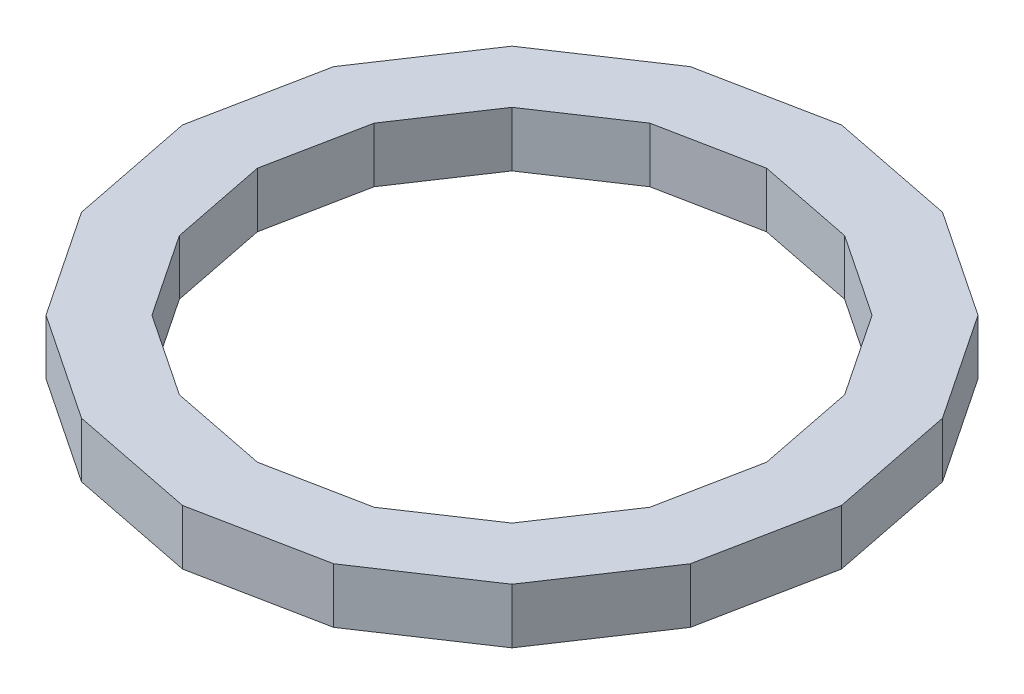
ISO-10303-21;
HEADER;
FILE_DESCRIPTION(('STEP AP214'),'2;1');
FILE_NAME('part.step','',(''),(''),'','','');
FILE_SCHEMA(('AUTOMOTIVE_DESIGN { 1 0 10303 214 1 1 1 1 }'));
ENDSEC;
DATA;
#1=APPLICATION_CONTEXT('core data for automotive mechanical design processes');
#2=APPLICATION_PROTOCOL_DEFINITION('international standard','automotive_design',2000,#1);
#3=PRODUCT_CONTEXT('',#1,'mechanical');
#4=PRODUCT('Part','Part','',(#3));
#5=PRODUCT_RELATED_PRODUCT_CATEGORY('part','',(#4));
#6=PRODUCT_DEFINITION_FORMATION('','',#4);
#7=PRODUCT_DEFINITION_CONTEXT('part definition',#1,'design');
#8=PRODUCT_DEFINITION('design','',#6,#7);
#9=PRODUCT_DEFINITION_SHAPE('','',#8);
#10=(LENGTH_UNIT() NAMED_UNIT(*) SI_UNIT(.MILLI.,.METRE.));
#11=(NAMED_UNIT(*) PLANE_ANGLE_UNIT() SI_UNIT($,.RADIAN.));
#12=(NAMED_UNIT(*) SI_UNIT($,.STERADIAN.) SOLID_ANGLE_UNIT());
#13=UNCERTAINTY_MEASURE_WITH_UNIT(LENGTH_MEASURE(1.E-05),#10,'distance_accuracy_value','');
#14=(GEOMETRIC_REPRESENTATION_CONTEXT(3) GLOBAL_UNCERTAINTY_ASSIGNED_CONTEXT((#13)) GLOBAL_UNIT_ASSIGNED_CONTEXT((#10,
#11,#12)) REPRESENTATION_CONTEXT('',''));
#15=CARTESIAN_POINT('',(0.,0.,0.));
#16=DIRECTION('',(0.,0.,1.));
#17=DIRECTION('',(1.,0.,0.));
#18=AXIS2_PLACEMENT_3D('',#15,#16,#17);
#19=CARTESIAN_POINT('',(0.,19.05,0.));
#20=DIRECTION('',(0.,1.,0.));
#21=DIRECTION('',(0.,0.,1.));
#22=AXIS2_PLACEMENT_3D('',#19,#20,#21);
#23=PLANE('',#22);
#24=DIRECTION('',(0.195090322016117,0.,-0.980785280403233));
#25=VECTOR('',#24,1.);
#26=CARTESIAN_POINT('',(105.249826838494,19.05,43.5959057139224));
#27=LINE('',#26,#25);
#28=CARTESIAN_POINT('',(105.249826838494,19.05,43.5959057139224));
#29=VERTEX_POINT('',#28);
#30=CARTESIAN_POINT('',(113.92159165211,19.05,-1.30104753782133E-12));
#31=VERTEX_POINT('',#30);
#32=EDGE_CURVE('E380',#29,#31,#27,.T.);
#33=ORIENTED_EDGE('',*,*,#32,.T.);
#34=DIRECTION('',(-0.195090322016139,0.,-0.980785280403228));
#35=VECTOR('',#34,1.);
#36=CARTESIAN_POINT('',(113.92159165211,19.05,-1.30104753782133E-12));
#37=LINE('',#36,#35);
#38=CARTESIAN_POINT('',(105.249826838493,19.05,-43.5959057139248));
#39=VERTEX_POINT('',#38);
#40=EDGE_CURVE('E384',#31,#39,#37,.T.);
#41=ORIENTED_EDGE('',*,*,#40,.T.);
#42=DIRECTION('',(-0.555570233019612,0.,-0.831469612302538));
#43=VECTOR('',#42,1.);
#44=CARTESIAN_POINT('',(105.249826838493,19.05,-43.5959057139248));
#45=LINE('',#44,#43);
#46=CARTESIAN_POINT('',(80.5547299807708,19.05,-80.5547299807726));
#47=VERTEX_POINT('',#46);
#48=EDGE_CURVE('E388',#39,#47,#45,.T.);
#49=ORIENTED_EDGE('',*,*,#48,.T.);
#50=DIRECTION('',(-0.831469612302551,0.,-0.555570233019593));
#51=VECTOR('',#50,1.);
#52=CARTESIAN_POINT('',(80.5547299807708,19.05,-80.5547299807726));
#53=LINE('',#52,#51);
#54=CARTESIAN_POINT('',(43.5959057139224,19.05,-105.249826838494));
#55=VERTEX_POINT('',#54);
#56=EDGE_CURVE('E391',#47,#55,#53,.T.);
#57=ORIENTED_EDGE('',*,*,#56,.T.);
#58=DIRECTION('',(-0.980785280403233,0.,-0.195090322016117));
#59=VECTOR('',#58,1.);
#60=CARTESIAN_POINT('',(43.5959057139224,19.05,-105.249826838494));
#61=LINE('',#60,#59);
#62=CARTESIAN_POINT('',(-1.30282443333279E-12,19.05,-113.92159165211));
#63=VERTEX_POINT('',#62);
#64=EDGE_CURVE('E393',#55,#63,#61,.T.);
#65=ORIENTED_EDGE('',*,*,#64,.T.);
#66=DIRECTION('',(-0.980785280403228,0.,0.195090322016139));
#67=VECTOR('',#66,1.);
#68=CARTESIAN_POINT('',(-1.30282443333279E-12,19.05,-113.92159165211));
#69=LINE('',#68,#67);
#70=CARTESIAN_POINT('',(-43.5959057139248,19.05,-105.249826838493));
#71=VERTEX_POINT('',#70);
#72=EDGE_CURVE('E395',#63,#71,#69,.T.);
#73=ORIENTED_EDGE('',*,*,#72,.T.);
#74=DIRECTION('',(-0.831469612302539,0.,0.555570233019612));
#75=VECTOR('',#74,1.);
#76=CARTESIAN_POINT('',(-43.5959057139248,19.05,-105.249826838493));
#77=LINE('',#76,#75);
#78=CARTESIAN_POINT('',(-80.5547299807726,19.05,-80.5547299807708));
#79=VERTEX_POINT('',#78);
#80=EDGE_CURVE('E397',#71,#79,#77,.T.);
#81=ORIENTED_EDGE('',*,*,#80,.T.);
#82=DIRECTION('',(-0.555570233019592,0.,0.831469612302552));
#83=VECTOR('',#82,1.);
#84=CARTESIAN_POINT('',(-80.5547299807726,19.05,-80.5547299807708));
#85=LINE('',#84,#83);
#86=CARTESIAN_POINT('',(-105.249826838494,19.05,-43.5959057139223));
#87=VERTEX_POINT('',#86);
#88=EDGE_CURVE('E399',#79,#87,#85,.T.);
#89=ORIENTED_EDGE('',*,*,#88,.T.);
#90=DIRECTION('',(-0.195090322016117,0.,0.980785280403233));
#91=VECTOR('',#90,1.);
#92=CARTESIAN_POINT('',(-105.249826838494,19.05,-43.5959057139223));
#93=LINE('',#92,#91);
#94=CARTESIAN_POINT('',(-113.92159165211,19.05,1.29133654033675E-12));
#95=VERTEX_POINT('',#94);
#96=EDGE_CURVE('E401',#87,#95,#93,.T.);
#97=ORIENTED_EDGE('',*,*,#96,.T.);
#98=DIRECTION('',(0.195090322016139,0.,0.980785280403228));
#99=VECTOR('',#98,1.);
#100=CARTESIAN_POINT('',(-113.92159165211,19.05,1.29133654033675E-12));
#101=LINE('',#100,#99);
#102=CARTESIAN_POINT('',(-105.249826838493,19.05,43.5959057139248));
#103=VERTEX_POINT('',#102);
#104=EDGE_CURVE('E403',#95,#103,#101,.T.);
#105=ORIENTED_EDGE('',*,*,#104,.T.);
#106=DIRECTION('',(0.555570233019612,0.,0.831469612302539));
#107=VECTOR('',#106,1.);
#108=CARTESIAN_POINT('',(-105.249826838493,19.05,43.5959057139248));
#109=LINE('',#108,#107);
#110=CARTESIAN_POINT('',(-80.5547299807708,19.05,80.5547299807726));
#111=VERTEX_POINT('',#110);
#112=EDGE_CURVE('E405',#103,#111,#109,.T.);
#113=ORIENTED_EDGE('',*,*,#112,.T.);
#114=DIRECTION('',(0.831469612302552,0.,0.555570233019593));
#115=VECTOR('',#114,1.);
#116=CARTESIAN_POINT('',(-80.5547299807708,19.05,80.5547299807726));
#117=LINE('',#116,#115);
#118=CARTESIAN_POINT('',(-43.5959057139224,19.05,105.249826838494));
#119=VERTEX_POINT('',#118);
#120=EDGE_CURVE('E407',#111,#119,#117,.T.);
#121=ORIENTED_EDGE('',*,*,#120,.T.);
#122=DIRECTION('',(0.980785280403233,0.,0.195090322016117));
#123=VECTOR('',#122,1.);
#124=CARTESIAN_POINT('',(-43.5959057139224,19.05,105.249826838494));
#125=LINE('',#124,#123);
#126=CARTESIAN_POINT('',(1.2751882066272E-12,19.05,113.92159165211));
#127=VERTEX_POINT('',#126);
#128=EDGE_CURVE('E409',#119,#127,#125,.T.);
#129=ORIENTED_EDGE('',*,*,#128,.T.);
#130=DIRECTION('',(0.980785280403228,0.,-0.195090322016139));
#131=VECTOR('',#130,1.);
#132=CARTESIAN_POINT('',(1.2751882066272E-12,19.05,113.92159165211));
#133=LINE('',#132,#131);
#134=CARTESIAN_POINT('',(43.5959057139248,19.05,105.249826838493));
#135=VERTEX_POINT('',#134);
#136=EDGE_CURVE('E411',#127,#135,#133,.T.);
#137=ORIENTED_EDGE('',*,*,#136,.T.);
#138=DIRECTION('',(0.831469612302539,0.,-0.555570233019612));
#139=VECTOR('',#138,1.);
#140=CARTESIAN_POINT('',(43.5959057139248,19.05,105.249826838493));
#141=LINE('',#140,#139);
#142=CARTESIAN_POINT('',(80.5547299807726,19.05,80.5547299807708));
#143=VERTEX_POINT('',#142);
#144=EDGE_CURVE('E413',#135,#143,#141,.T.);
#145=ORIENTED_EDGE('',*,*,#144,.T.);
#146=DIRECTION('',(0.555570233019593,0.,-0.831469612302552));
#147=VECTOR('',#146,1.);
#148=CARTESIAN_POINT('',(80.5547299807726,19.05,80.5547299807708));
#149=LINE('',#148,#147);
#150=EDGE_CURVE('E415',#143,#29,#149,.T.);
#151=ORIENTED_EDGE('',*,*,#150,.T.);
#152=EDGE_LOOP('',(#33,#41,#49,#57,#65,#73,#81,#89,#97,#105,#113,#121,#129,#137,#145,#151));
#153=FACE_BOUND('',#152,.T.);
#154=DIRECTION('',(-0.19509032201614,0.,-0.980785280403228));
#155=VECTOR('',#154,1.);
#156=CARTESIAN_POINT('',(88.0239762336186,19.05,-1.0275439763759E-12));
#157=LINE('',#156,#155);
#158=CARTESIAN_POINT('',(88.0239762336186,19.05,-1.0275439763759E-12));
#159=VERTEX_POINT('',#158);
#160=CARTESIAN_POINT('',(81.3235500124998,19.05,-33.6853173555052));
#161=VERTEX_POINT('',#160);
#162=EDGE_CURVE('E253',#159,#161,#157,.T.);
#163=ORIENTED_EDGE('',*,*,#162,.F.);
#164=DIRECTION('',(0.195090322016117,0.,-0.980785280403233));
#165=VECTOR('',#164,1.);
#166=CARTESIAN_POINT('',(81.3235500125006,19.05,33.6853173555033));
#167=LINE('',#166,#165);
#168=CARTESIAN_POINT('',(81.3235500125006,19.05,33.6853173555033));
#169=VERTEX_POINT('',#168);
#170=EDGE_CURVE('E244',#169,#159,#167,.T.);
#171=ORIENTED_EDGE('',*,*,#170,.F.);
#172=DIRECTION('',(0.555570233019593,0.,-0.831469612302552));
#173=VECTOR('',#172,1.);
#174=CARTESIAN_POINT('',(62.2423505017959,19.05,62.2423505017945));
#175=LINE('',#174,#173);
#176=CARTESIAN_POINT('',(62.2423505017959,19.05,62.2423505017945));
#177=VERTEX_POINT('',#176);
#178=EDGE_CURVE('E303',#177,#169,#175,.T.);
#179=ORIENTED_EDGE('',*,*,#178,.F.);
#180=DIRECTION('',(0.831469612302539,0.,-0.555570233019612));
#181=VECTOR('',#180,1.);
#182=CARTESIAN_POINT('',(33.6853173555052,19.05,81.3235500124998));
#183=LINE('',#182,#181);
#184=CARTESIAN_POINT('',(33.6853173555052,19.05,81.3235500124998));
#185=VERTEX_POINT('',#184);
#186=EDGE_CURVE('E301',#185,#177,#183,.T.);
#187=ORIENTED_EDGE('',*,*,#186,.F.);
#188=DIRECTION('',(0.980785280403228,0.,-0.19509032201614));
#189=VECTOR('',#188,1.);
#190=CARTESIAN_POINT('',(9.863004184879E-13,19.05,88.0239762336186));
#191=LINE('',#190,#189);
#192=CARTESIAN_POINT('',(9.863004184879E-13,19.05,88.0239762336186));
#193=VERTEX_POINT('',#192);
#194=EDGE_CURVE('E299',#193,#185,#191,.T.);
#195=ORIENTED_EDGE('',*,*,#194,.F.);
#196=DIRECTION('',(0.980785280403233,0.,0.195090322016117));
#197=VECTOR('',#196,1.);
#198=CARTESIAN_POINT('',(-33.6853173555033,19.05,81.3235500125006));
#199=LINE('',#198,#197);
#200=CARTESIAN_POINT('',(-33.6853173555033,19.05,81.3235500125006));
#201=VERTEX_POINT('',#200);
#202=EDGE_CURVE('E297',#201,#193,#199,.T.);
#203=ORIENTED_EDGE('',*,*,#202,.F.);
#204=DIRECTION('',(0.831469612302552,0.,0.555570233019593));
#205=VECTOR('',#204,1.);
#206=CARTESIAN_POINT('',(-62.2423505017944,19.05,62.2423505017959));
#207=LINE('',#206,#205);
#208=CARTESIAN_POINT('',(-62.2423505017944,19.05,62.2423505017959));
#209=VERTEX_POINT('',#208);
#210=EDGE_CURVE('E295',#209,#201,#207,.T.);
#211=ORIENTED_EDGE('',*,*,#210,.F.);
#212=DIRECTION('',(0.555570233019612,0.,0.831469612302539));
#213=VECTOR('',#212,1.);
#214=CARTESIAN_POINT('',(-81.3235500124998,19.05,33.6853173555052));
#215=LINE('',#214,#213);
#216=CARTESIAN_POINT('',(-81.3235500124998,19.05,33.6853173555052));
#217=VERTEX_POINT('',#216);
#218=EDGE_CURVE('E292',#217,#209,#215,.T.);
#219=ORIENTED_EDGE('',*,*,#218,.F.);
#220=DIRECTION('',(0.19509032201614,0.,0.980785280403228));
#221=VECTOR('',#220,1.);
#222=CARTESIAN_POINT('',(-88.0239762336186,19.05,1.05508386293723E-12));
#223=LINE('',#222,#221);
#224=CARTESIAN_POINT('',(-88.0239762336186,19.05,1.05508386293723E-12));
#225=VERTEX_POINT('',#224);
#226=EDGE_CURVE('E290',#225,#217,#223,.T.);
#227=ORIENTED_EDGE('',*,*,#226,.F.);
#228=DIRECTION('',(-0.195090322016117,0.,0.980785280403233));
#229=VECTOR('',#228,1.);
#230=CARTESIAN_POINT('',(-81.3235500125005,19.05,-33.6853173555033));
#231=LINE('',#230,#229);
#232=CARTESIAN_POINT('',(-81.3235500125005,19.05,-33.6853173555033));
#233=VERTEX_POINT('',#232);
#234=EDGE_CURVE('E287',#233,#225,#231,.T.);
#235=ORIENTED_EDGE('',*,*,#234,.F.);
#236=DIRECTION('',(-0.555570233019592,0.,0.831469612302552));
#237=VECTOR('',#236,1.);
#238=CARTESIAN_POINT('',(-62.2423505017959,19.05,-62.2423505017945));
#239=LINE('',#238,#237);
#240=CARTESIAN_POINT('',(-62.2423505017959,19.05,-62.2423505017945));
#241=VERTEX_POINT('',#240);
#242=EDGE_CURVE('E285',#241,#233,#239,.T.);
#243=ORIENTED_EDGE('',*,*,#242,.F.);
#244=DIRECTION('',(-0.831469612302539,0.,0.555570233019612));
#245=VECTOR('',#244,1.);
#246=CARTESIAN_POINT('',(-33.6853173555052,19.05,-81.3235500124998));
#247=LINE('',#246,#245);
#248=CARTESIAN_POINT('',(-33.6853173555052,19.05,-81.3235500124998));
#249=VERTEX_POINT('',#248);
#250=EDGE_CURVE('E282',#249,#241,#247,.T.);
#251=ORIENTED_EDGE('',*,*,#250,.F.);
#252=DIRECTION('',(-0.980785280403228,0.,0.19509032201614));
#253=VECTOR('',#252,1.);
#254=CARTESIAN_POINT('',(-1.03390459015156E-12,19.05,-88.0239762336186));
#255=LINE('',#254,#253);
#256=CARTESIAN_POINT('',(-1.03390459015156E-12,19.05,-88.0239762336186));
#257=VERTEX_POINT('',#256);
#258=EDGE_CURVE('E280',#257,#249,#255,.T.);
#259=ORIENTED_EDGE('',*,*,#258,.F.);
#260=DIRECTION('',(-0.980785280403233,0.,-0.195090322016117));
#261=VECTOR('',#260,1.);
#262=CARTESIAN_POINT('',(33.6853173555034,19.05,-81.3235500125005));
#263=LINE('',#262,#261);
#264=CARTESIAN_POINT('',(33.6853173555034,19.05,-81.3235500125005));
#265=VERTEX_POINT('',#264);
#266=EDGE_CURVE('E278',#265,#257,#263,.T.);
#267=ORIENTED_EDGE('',*,*,#266,.F.);
#268=DIRECTION('',(-0.831469612302552,0.,-0.555570233019592));
#269=VECTOR('',#268,1.);
#270=CARTESIAN_POINT('',(62.2423505017945,19.05,-62.242350501796));
#271=LINE('',#270,#269);
#272=CARTESIAN_POINT('',(62.2423505017945,19.05,-62.242350501796));
#273=VERTEX_POINT('',#272);
#274=EDGE_CURVE('E273',#273,#265,#271,.T.);
#275=ORIENTED_EDGE('',*,*,#274,.F.);
#276=DIRECTION('',(-0.555570233019612,0.,-0.831469612302539));
#277=VECTOR('',#276,1.);
#278=CARTESIAN_POINT('',(81.3235500124998,19.05,-33.6853173555052));
#279=LINE('',#278,#277);
#280=EDGE_CURVE('E266',#161,#273,#279,.T.);
#281=ORIENTED_EDGE('',*,*,#280,.F.);
#282=EDGE_LOOP('',(#163,#171,#179,#187,#195,#203,#211,#219,#227,#235,#243,#251,#259,#267,#275,#281));
#283=FACE_BOUND('',#282,.T.);
#284=ADVANCED_FACE('F35',(#153,#283),#23,.T.);
#285=CARTESIAN_POINT('',(0.,0.,0.));
#286=DIRECTION('',(0.,1.,0.));
#287=DIRECTION('',(0.,0.,1.));
#288=AXIS2_PLACEMENT_3D('',#285,#286,#287);
#289=PLANE('',#288);
#290=DIRECTION('',(0.195090322016117,0.,-0.980785280403233));
#291=VECTOR('',#290,1.);
#292=CARTESIAN_POINT('',(105.249826838494,0.,43.5959057139224));
#293=LINE('',#292,#291);
#294=CARTESIAN_POINT('',(105.249826838494,0.,43.5959057139224));
#295=VERTEX_POINT('',#294);
#296=CARTESIAN_POINT('',(113.92159165211,0.,-1.30104753782133E-12));
#297=VERTEX_POINT('',#296);
#298=EDGE_CURVE('E261',#295,#297,#293,.T.);
#299=ORIENTED_EDGE('',*,*,#298,.F.);
#300=DIRECTION('',(0.555570233019593,0.,-0.831469612302552));
#301=VECTOR('',#300,1.);
#302=CARTESIAN_POINT('',(80.5547299807726,0.,80.5547299807708));
#303=LINE('',#302,#301);
#304=CARTESIAN_POINT('',(80.5547299807726,0.,80.5547299807708));
#305=VERTEX_POINT('',#304);
#306=EDGE_CURVE('E385',#305,#295,#303,.T.);
#307=ORIENTED_EDGE('',*,*,#306,.F.);
#308=DIRECTION('',(0.831469612302539,0.,-0.555570233019612));
#309=VECTOR('',#308,1.);
#310=CARTESIAN_POINT('',(43.5959057139248,0.,105.249826838493));
#311=LINE('',#310,#309);
#312=CARTESIAN_POINT('',(43.5959057139248,0.,105.249826838493));
#313=VERTEX_POINT('',#312);
#314=EDGE_CURVE('E449',#313,#305,#311,.T.);
#315=ORIENTED_EDGE('',*,*,#314,.F.);
#316=DIRECTION('',(0.980785280403228,0.,-0.195090322016139));
#317=VECTOR('',#316,1.);
#318=CARTESIAN_POINT('',(1.2751882066272E-12,0.,113.92159165211));
#319=LINE('',#318,#317);
#320=CARTESIAN_POINT('',(1.2751882066272E-12,0.,113.92159165211));
#321=VERTEX_POINT('',#320);
#322=EDGE_CURVE('E447',#321,#313,#319,.T.);
#323=ORIENTED_EDGE('',*,*,#322,.F.);
#324=DIRECTION('',(0.980785280403233,0.,0.195090322016117));
#325=VECTOR('',#324,1.);
#326=CARTESIAN_POINT('',(-43.5959057139224,0.,105.249826838494));
#327=LINE('',#326,#325);
#328=CARTESIAN_POINT('',(-43.5959057139224,0.,105.249826838494));
#329=VERTEX_POINT('',#328);
#330=EDGE_CURVE('E444',#329,#321,#327,.T.);
#331=ORIENTED_EDGE('',*,*,#330,.F.);
#332=DIRECTION('',(0.831469612302552,0.,0.555570233019593));
#333=VECTOR('',#332,1.);
#334=CARTESIAN_POINT('',(-80.5547299807708,0.,80.5547299807726));
#335=LINE('',#334,#333);
#336=CARTESIAN_POINT('',(-80.5547299807708,0.,80.5547299807726));
#337=VERTEX_POINT('',#336);
#338=EDGE_CURVE('E442',#337,#329,#335,.T.);
#339=ORIENTED_EDGE('',*,*,#338,.F.);
#340=DIRECTION('',(0.555570233019612,0.,0.831469612302539));
#341=VECTOR('',#340,1.);
#342=CARTESIAN_POINT('',(-105.249826838493,0.,43.5959057139248));
#343=LINE('',#342,#341);
#344=CARTESIAN_POINT('',(-105.249826838493,0.,43.5959057139248));
#345=VERTEX_POINT('',#344);
#346=EDGE_CURVE('E440',#345,#337,#343,.T.);
#347=ORIENTED_EDGE('',*,*,#346,.F.);
#348=DIRECTION('',(0.195090322016139,0.,0.980785280403228));
#349=VECTOR('',#348,1.);
#350=CARTESIAN_POINT('',(-113.92159165211,0.,1.29133654033675E-12));
#351=LINE('',#350,#349);
#352=CARTESIAN_POINT('',(-113.92159165211,0.,1.29133654033675E-12));
#353=VERTEX_POINT('',#352);
#354=EDGE_CURVE('E438',#353,#345,#351,.T.);
#355=ORIENTED_EDGE('',*,*,#354,.F.);
#356=DIRECTION('',(-0.195090322016117,0.,0.980785280403233));
#357=VECTOR('',#356,1.);
#358=CARTESIAN_POINT('',(-105.249826838494,0.,-43.5959057139223));
#359=LINE('',#358,#357);
#360=CARTESIAN_POINT('',(-105.249826838494,0.,-43.5959057139223));
#361=VERTEX_POINT('',#360);
#362=EDGE_CURVE('E436',#361,#353,#359,.T.);
#363=ORIENTED_EDGE('',*,*,#362,.F.);
#364=DIRECTION('',(-0.555570233019592,0.,0.831469612302552));
#365=VECTOR('',#364,1.);
#366=CARTESIAN_POINT('',(-80.5547299807726,0.,-80.5547299807708));
#367=LINE('',#366,#365);
#368=CARTESIAN_POINT('',(-80.5547299807726,0.,-80.5547299807708));
#369=VERTEX_POINT('',#368);
#370=EDGE_CURVE('E434',#369,#361,#367,.T.);
#371=ORIENTED_EDGE('',*,*,#370,.F.);
#372=DIRECTION('',(-0.831469612302539,0.,0.555570233019612));
#373=VECTOR('',#372,1.);
#374=CARTESIAN_POINT('',(-43.5959057139248,0.,-105.249826838493));
#375=LINE('',#374,#373);
#376=CARTESIAN_POINT('',(-43.5959057139248,0.,-105.249826838493));
#377=VERTEX_POINT('',#376);
#378=EDGE_CURVE('E432',#377,#369,#375,.T.);
#379=ORIENTED_EDGE('',*,*,#378,.F.);
#380=DIRECTION('',(-0.980785280403228,0.,0.195090322016139));
#381=VECTOR('',#380,1.);
#382=CARTESIAN_POINT('',(-1.30282443333279E-12,0.,-113.92159165211));
#383=LINE('',#382,#381);
#384=CARTESIAN_POINT('',(-1.30282443333279E-12,0.,-113.92159165211));
#385=VERTEX_POINT('',#384);
#386=EDGE_CURVE('E430',#385,#377,#383,.T.);
#387=ORIENTED_EDGE('',*,*,#386,.F.);
#388=DIRECTION('',(-0.980785280403233,0.,-0.195090322016117));
#389=VECTOR('',#388,1.);
#390=CARTESIAN_POINT('',(43.5959057139224,0.,-105.249826838494));
#391=LINE('',#390,#389);
#392=CARTESIAN_POINT('',(43.5959057139224,0.,-105.249826838494));
#393=VERTEX_POINT('',#392);
#394=EDGE_CURVE('E428',#393,#385,#391,.T.);
#395=ORIENTED_EDGE('',*,*,#394,.F.);
#396=DIRECTION('',(-0.831469612302551,0.,-0.555570233019593));
#397=VECTOR('',#396,1.);
#398=CARTESIAN_POINT('',(80.5547299807708,0.,-80.5547299807726));
#399=LINE('',#398,#397);
#400=CARTESIAN_POINT('',(80.5547299807708,0.,-80.5547299807726));
#401=VERTEX_POINT('',#400);
#402=EDGE_CURVE('E426',#401,#393,#399,.T.);
#403=ORIENTED_EDGE('',*,*,#402,.F.);
#404=DIRECTION('',(-0.555570233019612,0.,-0.831469612302538));
#405=VECTOR('',#404,1.);
#406=CARTESIAN_POINT('',(105.249826838493,0.,-43.5959057139248));
#407=LINE('',#406,#405);
#408=CARTESIAN_POINT('',(105.249826838493,0.,-43.5959057139248));
#409=VERTEX_POINT('',#408);
#410=EDGE_CURVE('E423',#409,#401,#407,.T.);
#411=ORIENTED_EDGE('',*,*,#410,.F.);
#412=DIRECTION('',(-0.195090322016139,0.,-0.980785280403228));
#413=VECTOR('',#412,1.);
#414=CARTESIAN_POINT('',(113.92159165211,0.,-1.30104753782133E-12));
#415=LINE('',#414,#413);
#416=EDGE_CURVE('E420',#297,#409,#415,.T.);
#417=ORIENTED_EDGE('',*,*,#416,.F.);
#418=EDGE_LOOP('',(#299,#307,#315,#323,#331,#339,#347,#355,#363,#371,#379,#387,#395,#403,#411,#417));
#419=FACE_BOUND('',#418,.T.);
#420=DIRECTION('',(0.195090322016117,0.,-0.980785280403233));
#421=VECTOR('',#420,1.);
#422=CARTESIAN_POINT('',(81.3235500125006,0.,33.6853173555033));
#423=LINE('',#422,#421);
#424=CARTESIAN_POINT('',(81.3235500125006,0.,33.6853173555033));
#425=VERTEX_POINT('',#424);
#426=CARTESIAN_POINT('',(88.0239762336186,0.,-1.0275439763759E-12));
#427=VERTEX_POINT('',#426);
#428=EDGE_CURVE('E58',#425,#427,#423,.T.);
#429=ORIENTED_EDGE('',*,*,#428,.T.);
#430=DIRECTION('',(-0.19509032201614,0.,-0.980785280403228));
#431=VECTOR('',#430,1.);
#432=CARTESIAN_POINT('',(88.0239762336186,0.,-1.0275439763759E-12));
#433=LINE('',#432,#431);
#434=CARTESIAN_POINT('',(81.3235500124998,0.,-33.6853173555052));
#435=VERTEX_POINT('',#434);
#436=EDGE_CURVE('E260',#427,#435,#433,.T.);
#437=ORIENTED_EDGE('',*,*,#436,.T.);
#438=DIRECTION('',(-0.555570233019612,0.,-0.831469612302539));
#439=VECTOR('',#438,1.);
#440=CARTESIAN_POINT('',(81.3235500124998,0.,-33.6853173555052));
#441=LINE('',#440,#439);
#442=CARTESIAN_POINT('',(62.2423505017945,0.,-62.242350501796));
#443=VERTEX_POINT('',#442);
#444=EDGE_CURVE('E309',#435,#443,#441,.T.);
#445=ORIENTED_EDGE('',*,*,#444,.T.);
#446=DIRECTION('',(-0.831469612302552,0.,-0.555570233019592));
#447=VECTOR('',#446,1.);
#448=CARTESIAN_POINT('',(62.2423505017945,0.,-62.242350501796));
#449=LINE('',#448,#447);
#450=CARTESIAN_POINT('',(33.6853173555034,0.,-81.3235500125005));
#451=VERTEX_POINT('',#450);
#452=EDGE_CURVE('E312',#443,#451,#449,.T.);
#453=ORIENTED_EDGE('',*,*,#452,.T.);
#454=DIRECTION('',(-0.980785280403233,0.,-0.195090322016117));
#455=VECTOR('',#454,1.);
#456=CARTESIAN_POINT('',(33.6853173555034,0.,-81.3235500125005));
#457=LINE('',#456,#455);
#458=CARTESIAN_POINT('',(-1.03390459015156E-12,0.,-88.0239762336186));
#459=VERTEX_POINT('',#458);
#460=EDGE_CURVE('E315',#451,#459,#457,.T.);
#461=ORIENTED_EDGE('',*,*,#460,.T.);
#462=DIRECTION('',(-0.980785280403228,0.,0.19509032201614));
#463=VECTOR('',#462,1.);
#464=CARTESIAN_POINT('',(-1.03390459015156E-12,0.,-88.0239762336186));
#465=LINE('',#464,#463);
#466=CARTESIAN_POINT('',(-33.6853173555052,0.,-81.3235500124998));
#467=VERTEX_POINT('',#466);
#468=EDGE_CURVE('E319',#459,#467,#465,.T.);
#469=ORIENTED_EDGE('',*,*,#468,.T.);
#470=DIRECTION('',(-0.831469612302539,0.,0.555570233019612));
#471=VECTOR('',#470,1.);
#472=CARTESIAN_POINT('',(-33.6853173555052,0.,-81.3235500124998));
#473=LINE('',#472,#471);
#474=CARTESIAN_POINT('',(-62.2423505017959,0.,-62.2423505017945));
#475=VERTEX_POINT('',#474);
#476=EDGE_CURVE('E323',#467,#475,#473,.T.);
#477=ORIENTED_EDGE('',*,*,#476,.T.);
#478=DIRECTION('',(-0.555570233019592,0.,0.831469612302552));
#479=VECTOR('',#478,1.);
#480=CARTESIAN_POINT('',(-62.2423505017959,0.,-62.2423505017945));
#481=LINE('',#480,#479);
#482=CARTESIAN_POINT('',(-81.3235500125005,0.,-33.6853173555033));
#483=VERTEX_POINT('',#482);
#484=EDGE_CURVE('E327',#475,#483,#481,.T.);
#485=ORIENTED_EDGE('',*,*,#484,.T.);
#486=DIRECTION('',(-0.195090322016117,0.,0.980785280403233));
#487=VECTOR('',#486,1.);
#488=CARTESIAN_POINT('',(-81.3235500125005,0.,-33.6853173555033));
#489=LINE('',#488,#487);
#490=CARTESIAN_POINT('',(-88.0239762336186,0.,1.05508386293723E-12));
#491=VERTEX_POINT('',#490);
#492=EDGE_CURVE('E330',#483,#491,#489,.T.);
#493=ORIENTED_EDGE('',*,*,#492,.T.);
#494=DIRECTION('',(0.19509032201614,0.,0.980785280403228));
#495=VECTOR('',#494,1.);
#496=CARTESIAN_POINT('',(-88.0239762336186,0.,1.05508386293723E-12));
#497=LINE('',#496,#495);
#498=CARTESIAN_POINT('',(-81.3235500124998,0.,33.6853173555052));
#499=VERTEX_POINT('',#498);
#500=EDGE_CURVE('E333',#491,#499,#497,.T.);
#501=ORIENTED_EDGE('',*,*,#500,.T.);
#502=DIRECTION('',(0.555570233019612,0.,0.831469612302539));
#503=VECTOR('',#502,1.);
#504=CARTESIAN_POINT('',(-81.3235500124998,0.,33.6853173555052));
#505=LINE('',#504,#503);
#506=CARTESIAN_POINT('',(-62.2423505017944,0.,62.2423505017959));
#507=VERTEX_POINT('',#506);
#508=EDGE_CURVE('E336',#499,#507,#505,.T.);
#509=ORIENTED_EDGE('',*,*,#508,.T.);
#510=DIRECTION('',(0.831469612302552,0.,0.555570233019593));
#511=VECTOR('',#510,1.);
#512=CARTESIAN_POINT('',(-62.2423505017944,0.,62.2423505017959));
#513=LINE('',#512,#511);
#514=CARTESIAN_POINT('',(-33.6853173555033,0.,81.3235500125006));
#515=VERTEX_POINT('',#514);
#516=EDGE_CURVE('E339',#507,#515,#513,.T.);
#517=ORIENTED_EDGE('',*,*,#516,.T.);
#518=DIRECTION('',(0.980785280403233,0.,0.195090322016117));
#519=VECTOR('',#518,1.);
#520=CARTESIAN_POINT('',(-33.6853173555033,0.,81.3235500125006));
#521=LINE('',#520,#519);
#522=CARTESIAN_POINT('',(9.863004184879E-13,0.,88.0239762336186));
#523=VERTEX_POINT('',#522);
#524=EDGE_CURVE('E342',#515,#523,#521,.T.);
#525=ORIENTED_EDGE('',*,*,#524,.T.);
#526=DIRECTION('',(0.980785280403228,0.,-0.19509032201614));
#527=VECTOR('',#526,1.);
#528=CARTESIAN_POINT('',(9.863004184879E-13,0.,88.0239762336186));
#529=LINE('',#528,#527);
#530=CARTESIAN_POINT('',(33.6853173555052,0.,81.3235500124998));
#531=VERTEX_POINT('',#530);
#532=EDGE_CURVE('E345',#523,#531,#529,.T.);
#533=ORIENTED_EDGE('',*,*,#532,.T.);
#534=DIRECTION('',(0.831469612302539,0.,-0.555570233019612));
#535=VECTOR('',#534,1.);
#536=CARTESIAN_POINT('',(33.6853173555052,0.,81.3235500124998));
#537=LINE('',#536,#535);
#538=CARTESIAN_POINT('',(62.2423505017959,0.,62.2423505017945));
#539=VERTEX_POINT('',#538);
#540=EDGE_CURVE('E348',#531,#539,#537,.T.);
#541=ORIENTED_EDGE('',*,*,#540,.T.);
#542=DIRECTION('',(0.555570233019593,0.,-0.831469612302552));
#543=VECTOR('',#542,1.);
#544=CARTESIAN_POINT('',(62.2423505017959,0.,62.2423505017945));
#545=LINE('',#544,#543);
#546=EDGE_CURVE('E254',#539,#425,#545,.T.);
#547=ORIENTED_EDGE('',*,*,#546,.T.);
#548=EDGE_LOOP('',(#429,#437,#445,#453,#461,#469,#477,#485,#493,#501,#509,#517,#525,#533,#541,#547));
#549=FACE_BOUND('',#548,.T.);
#550=ADVANCED_FACE('F509',(#419,#549),#289,.F.);
#551=CARTESIAN_POINT('',(105.249826838494,19.05,43.5959057139224));
#552=DIRECTION('',(-0.980785280403233,0.,-0.195090322016117));
#553=DIRECTION('',(-0.195090322016117,0.,0.980785280403233));
#554=AXIS2_PLACEMENT_3D('',#551,#552,#553);
#555=PLANE('',#554);
#556=ORIENTED_EDGE('',*,*,#298,.T.);
#557=DIRECTION('',(0.,-1.,0.));
#558=VECTOR('',#557,1.);
#559=CARTESIAN_POINT('',(113.92159165211,19.05,-1.30104753782133E-12));
#560=LINE('',#559,#558);
#561=EDGE_CURVE('E11',#31,#297,#560,.T.);
#562=ORIENTED_EDGE('',*,*,#561,.F.);
#563=ORIENTED_EDGE('',*,*,#32,.F.);
#564=DIRECTION('',(0.,-1.,0.));
#565=VECTOR('',#564,1.);
#566=CARTESIAN_POINT('',(105.249826838494,19.05,43.5959057139224));
#567=LINE('',#566,#565);
#568=EDGE_CURVE('E417',#29,#295,#567,.T.);
#569=ORIENTED_EDGE('',*,*,#568,.T.);
#570=EDGE_LOOP('',(#556,#562,#563,#569));
#571=FACE_BOUND('',#570,.T.);
#572=ADVANCED_FACE('F37',(#571),#555,.F.);
#573=CARTESIAN_POINT('',(113.92159165211,19.05,-1.30104753782133E-12));
#574=DIRECTION('',(-0.980785280403228,0.,0.195090322016139));
#575=DIRECTION('',(0.195090322016139,0.,0.980785280403228));
#576=AXIS2_PLACEMENT_3D('',#573,#574,#575);
#577=PLANE('',#576);
#578=ORIENTED_EDGE('',*,*,#416,.T.);
#579=DIRECTION('',(0.,-1.,0.));
#580=VECTOR('',#579,1.);
#581=CARTESIAN_POINT('',(105.249826838493,19.05,-43.5959057139248));
#582=LINE('',#581,#580);
#583=EDGE_CURVE('E43',#39,#409,#582,.T.);
#584=ORIENTED_EDGE('',*,*,#583,.F.);
#585=ORIENTED_EDGE('',*,*,#40,.F.);
#586=ORIENTED_EDGE('',*,*,#561,.T.);
#587=EDGE_LOOP('',(#578,#584,#585,#586));
#588=FACE_BOUND('',#587,.T.);
#589=ADVANCED_FACE('F526',(#588),#577,.F.);
#590=CARTESIAN_POINT('',(105.249826838493,19.05,-43.5959057139248));
#591=DIRECTION('',(-0.831469612302539,0.,0.555570233019612));
#592=DIRECTION('',(0.555570233019612,0.,0.831469612302539));
#593=AXIS2_PLACEMENT_3D('',#590,#591,#592);
#594=PLANE('',#593);
#595=ORIENTED_EDGE('',*,*,#410,.T.);
#596=DIRECTION('',(0.,-1.,0.));
#597=VECTOR('',#596,1.);
#598=CARTESIAN_POINT('',(80.5547299807708,19.05,-80.5547299807726));
#599=LINE('',#598,#597);
#600=EDGE_CURVE('E494',#47,#401,#599,.T.);
#601=ORIENTED_EDGE('',*,*,#600,.F.);
#602=ORIENTED_EDGE('',*,*,#48,.F.);
#603=ORIENTED_EDGE('',*,*,#583,.T.);
#604=EDGE_LOOP('',(#595,#601,#602,#603));
#605=FACE_BOUND('',#604,.T.);
#606=ADVANCED_FACE('F503',(#605),#594,.F.);
#607=CARTESIAN_POINT('',(80.5547299807708,19.05,-80.5547299807726));
#608=DIRECTION('',(-0.555570233019593,0.,0.831469612302552));
#609=DIRECTION('',(0.831469612302552,0.,0.555570233019593));
#610=AXIS2_PLACEMENT_3D('',#607,#608,#609);
#611=PLANE('',#610);
#612=ORIENTED_EDGE('',*,*,#402,.T.);
#613=DIRECTION('',(0.,-1.,0.));
#614=VECTOR('',#613,1.);
#615=CARTESIAN_POINT('',(43.5959057139224,19.05,-105.249826838494));
#616=LINE('',#615,#614);
#617=EDGE_CURVE('E491',#55,#393,#616,.T.);
#618=ORIENTED_EDGE('',*,*,#617,.F.);
#619=ORIENTED_EDGE('',*,*,#56,.F.);
#620=ORIENTED_EDGE('',*,*,#600,.T.);
#621=EDGE_LOOP('',(#612,#618,#619,#620));
#622=FACE_BOUND('',#621,.T.);
#623=ADVANCED_FACE('F515',(#622),#611,.F.);
#624=CARTESIAN_POINT('',(43.5959057139224,19.05,-105.249826838494));
#625=DIRECTION('',(-0.195090322016117,0.,0.980785280403233));
#626=DIRECTION('',(0.980785280403233,0.,0.195090322016117));
#627=AXIS2_PLACEMENT_3D('',#624,#625,#626);
#628=PLANE('',#627);
#629=ORIENTED_EDGE('',*,*,#394,.T.);
#630=DIRECTION('',(0.,-1.,0.));
#631=VECTOR('',#630,1.);
#632=CARTESIAN_POINT('',(-1.30282443333279E-12,19.05,-113.92159165211));
#633=LINE('',#632,#631);
#634=EDGE_CURVE('E488',#63,#385,#633,.T.);
#635=ORIENTED_EDGE('',*,*,#634,.F.);
#636=ORIENTED_EDGE('',*,*,#64,.F.);
#637=ORIENTED_EDGE('',*,*,#617,.T.);
#638=EDGE_LOOP('',(#629,#635,#636,#637));
#639=FACE_BOUND('',#638,.T.);
#640=ADVANCED_FACE('F519',(#639),#628,.F.);
#641=CARTESIAN_POINT('',(-1.30282443333279E-12,19.05,-113.92159165211));
#642=DIRECTION('',(0.195090322016139,0.,0.980785280403228));
#643=DIRECTION('',(0.980785280403228,0.,-0.195090322016139));
#644=AXIS2_PLACEMENT_3D('',#641,#642,#643);
#645=PLANE('',#644);
#646=ORIENTED_EDGE('',*,*,#386,.T.);
#647=DIRECTION('',(0.,-1.,0.));
#648=VECTOR('',#647,1.);
#649=CARTESIAN_POINT('',(-43.5959057139248,19.05,-105.249826838493));
#650=LINE('',#649,#648);
#651=EDGE_CURVE('E485',#71,#377,#650,.T.);
#652=ORIENTED_EDGE('',*,*,#651,.F.);
#653=ORIENTED_EDGE('',*,*,#72,.F.);
#654=ORIENTED_EDGE('',*,*,#634,.T.);
#655=EDGE_LOOP('',(#646,#652,#653,#654));
#656=FACE_BOUND('',#655,.T.);
#657=ADVANCED_FACE('F579',(#656),#645,.F.);
#658=CARTESIAN_POINT('',(-43.5959057139248,19.05,-105.249826838493));
#659=DIRECTION('',(0.555570233019612,0.,0.831469612302539));
#660=DIRECTION('',(0.831469612302539,0.,-0.555570233019612));
#661=AXIS2_PLACEMENT_3D('',#658,#659,#660);
#662=PLANE('',#661);
#663=ORIENTED_EDGE('',*,*,#378,.T.);
#664=DIRECTION('',(0.,-1.,0.));
#665=VECTOR('',#664,1.);
#666=CARTESIAN_POINT('',(-80.5547299807726,19.05,-80.5547299807708));
#667=LINE('',#666,#665);
#668=EDGE_CURVE('E481',#79,#369,#667,.T.);
#669=ORIENTED_EDGE('',*,*,#668,.F.);
#670=ORIENTED_EDGE('',*,*,#80,.F.);
#671=ORIENTED_EDGE('',*,*,#651,.T.);
#672=EDGE_LOOP('',(#663,#669,#670,#671));
#673=FACE_BOUND('',#672,.T.);
#674=ADVANCED_FACE('F576',(#673),#662,.F.);
#675=CARTESIAN_POINT('',(-80.5547299807726,19.05,-80.5547299807708));
#676=DIRECTION('',(0.831469612302552,0.,0.555570233019592));
#677=DIRECTION('',(0.555570233019592,0.,-0.831469612302552));
#678=AXIS2_PLACEMENT_3D('',#675,#676,#677);
#679=PLANE('',#678);
#680=ORIENTED_EDGE('',*,*,#370,.T.);
#681=DIRECTION('',(0.,-1.,0.));
#682=VECTOR('',#681,1.);
#683=CARTESIAN_POINT('',(-105.249826838494,19.05,-43.5959057139223));
#684=LINE('',#683,#682);
#685=EDGE_CURVE('E478',#87,#361,#684,.T.);
#686=ORIENTED_EDGE('',*,*,#685,.F.);
#687=ORIENTED_EDGE('',*,*,#88,.F.);
#688=ORIENTED_EDGE('',*,*,#668,.T.);
#689=EDGE_LOOP('',(#680,#686,#687,#688));
#690=FACE_BOUND('',#689,.T.);
#691=ADVANCED_FACE('F572',(#690),#679,.F.);
#692=CARTESIAN_POINT('',(-105.249826838494,19.05,-43.5959057139223));
#693=DIRECTION('',(0.980785280403233,0.,0.195090322016117));
#694=DIRECTION('',(0.195090322016117,0.,-0.980785280403233));
#695=AXIS2_PLACEMENT_3D('',#692,#693,#694);
#696=PLANE('',#695);
#697=ORIENTED_EDGE('',*,*,#362,.T.);
#698=DIRECTION('',(0.,-1.,0.));
#699=VECTOR('',#698,1.);
#700=CARTESIAN_POINT('',(-113.92159165211,19.05,1.29133654033675E-12));
#701=LINE('',#700,#699);
#702=EDGE_CURVE('E475',#95,#353,#701,.T.);
#703=ORIENTED_EDGE('',*,*,#702,.F.);
#704=ORIENTED_EDGE('',*,*,#96,.F.);
#705=ORIENTED_EDGE('',*,*,#685,.T.);
#706=EDGE_LOOP('',(#697,#703,#704,#705));
#707=FACE_BOUND('',#706,.T.);
#708=ADVANCED_FACE('F568',(#707),#696,.F.);
#709=CARTESIAN_POINT('',(-113.92159165211,19.05,1.29133654033675E-12));
#710=DIRECTION('',(0.980785280403228,0.,-0.195090322016139));
#711=DIRECTION('',(-0.195090322016139,0.,-0.980785280403228));
#712=AXIS2_PLACEMENT_3D('',#709,#710,#711);
#713=PLANE('',#712);
#714=ORIENTED_EDGE('',*,*,#354,.T.);
#715=DIRECTION('',(0.,-1.,0.));
#716=VECTOR('',#715,1.);
#717=CARTESIAN_POINT('',(-105.249826838493,19.05,43.5959057139248));
#718=LINE('',#717,#716);
#719=EDGE_CURVE('E472',#103,#345,#718,.T.);
#720=ORIENTED_EDGE('',*,*,#719,.F.);
#721=ORIENTED_EDGE('',*,*,#104,.F.);
#722=ORIENTED_EDGE('',*,*,#702,.T.);
#723=EDGE_LOOP('',(#714,#720,#721,#722));
#724=FACE_BOUND('',#723,.T.);
#725=ADVANCED_FACE('F563',(#724),#713,.F.);
#726=CARTESIAN_POINT('',(-105.249826838493,19.05,43.5959057139248));
#727=DIRECTION('',(0.831469612302539,0.,-0.555570233019612));
#728=DIRECTION('',(-0.555570233019612,0.,-0.831469612302539));
#729=AXIS2_PLACEMENT_3D('',#726,#727,#728);
#730=PLANE('',#729);
#731=ORIENTED_EDGE('',*,*,#346,.T.);
#732=DIRECTION('',(0.,-1.,0.));
#733=VECTOR('',#732,1.);
#734=CARTESIAN_POINT('',(-80.5547299807708,19.05,80.5547299807726));
#735=LINE('',#734,#733);
#736=EDGE_CURVE('E468',#111,#337,#735,.T.);
#737=ORIENTED_EDGE('',*,*,#736,.F.);
#738=ORIENTED_EDGE('',*,*,#112,.F.);
#739=ORIENTED_EDGE('',*,*,#719,.T.);
#740=EDGE_LOOP('',(#731,#737,#738,#739));
#741=FACE_BOUND('',#740,.T.);
#742=ADVANCED_FACE('F557',(#741),#730,.F.);
#743=CARTESIAN_POINT('',(-80.5547299807708,19.05,80.5547299807726));
#744=DIRECTION('',(0.555570233019593,0.,-0.831469612302552));
#745=DIRECTION('',(-0.831469612302552,0.,-0.555570233019593));
#746=AXIS2_PLACEMENT_3D('',#743,#744,#745);
#747=PLANE('',#746);
#748=ORIENTED_EDGE('',*,*,#338,.T.);
#749=DIRECTION('',(0.,-1.,0.));
#750=VECTOR('',#749,1.);
#751=CARTESIAN_POINT('',(-43.5959057139224,19.05,105.249826838494));
#752=LINE('',#751,#750);
#753=EDGE_CURVE('E465',#119,#329,#752,.T.);
#754=ORIENTED_EDGE('',*,*,#753,.F.);
#755=ORIENTED_EDGE('',*,*,#120,.F.);
#756=ORIENTED_EDGE('',*,*,#736,.T.);
#757=EDGE_LOOP('',(#748,#754,#755,#756));
#758=FACE_BOUND('',#757,.T.);
#759=ADVANCED_FACE('F553',(#758),#747,.F.);
#760=CARTESIAN_POINT('',(-43.5959057139224,19.05,105.249826838494));
#761=DIRECTION('',(0.195090322016117,0.,-0.980785280403233));
#762=DIRECTION('',(-0.980785280403233,0.,-0.195090322016117));
#763=AXIS2_PLACEMENT_3D('',#760,#761,#762);
#764=PLANE('',#763);
#765=ORIENTED_EDGE('',*,*,#330,.T.);
#766=DIRECTION('',(0.,-1.,0.));
#767=VECTOR('',#766,1.);
#768=CARTESIAN_POINT('',(1.2751882066272E-12,19.05,113.92159165211));
#769=LINE('',#768,#767);
#770=EDGE_CURVE('E462',#127,#321,#769,.T.);
#771=ORIENTED_EDGE('',*,*,#770,.F.);
#772=ORIENTED_EDGE('',*,*,#128,.F.);
#773=ORIENTED_EDGE('',*,*,#753,.T.);
#774=EDGE_LOOP('',(#765,#771,#772,#773));
#775=FACE_BOUND('',#774,.T.);
#776=ADVANCED_FACE('F548',(#775),#764,.F.);
#777=CARTESIAN_POINT('',(1.2751882066272E-12,19.05,113.92159165211));
#778=DIRECTION('',(-0.195090322016139,0.,-0.980785280403228));
#779=DIRECTION('',(-0.980785280403228,0.,0.195090322016139));
#780=AXIS2_PLACEMENT_3D('',#777,#778,#779);
#781=PLANE('',#780);
#782=ORIENTED_EDGE('',*,*,#322,.T.);
#783=DIRECTION('',(0.,-1.,0.));
#784=VECTOR('',#783,1.);
#785=CARTESIAN_POINT('',(43.5959057139248,19.05,105.249826838493));
#786=LINE('',#785,#784);
#787=EDGE_CURVE('E458',#135,#313,#786,.T.);
#788=ORIENTED_EDGE('',*,*,#787,.F.);
#789=ORIENTED_EDGE('',*,*,#136,.F.);
#790=ORIENTED_EDGE('',*,*,#770,.T.);
#791=EDGE_LOOP('',(#782,#788,#789,#790));
#792=FACE_BOUND('',#791,.T.);
#793=ADVANCED_FACE('F542',(#792),#781,.F.);
#794=CARTESIAN_POINT('',(43.5959057139248,19.05,105.249826838493));
#795=DIRECTION('',(-0.555570233019612,0.,-0.831469612302539));
#796=DIRECTION('',(-0.831469612302539,0.,0.555570233019612));
#797=AXIS2_PLACEMENT_3D('',#794,#795,#796);
#798=PLANE('',#797);
#799=ORIENTED_EDGE('',*,*,#314,.T.);
#800=DIRECTION('',(0.,-1.,0.));
#801=VECTOR('',#800,1.);
#802=CARTESIAN_POINT('',(80.5547299807726,19.05,80.5547299807708));
#803=LINE('',#802,#801);
#804=EDGE_CURVE('E455',#143,#305,#803,.T.);
#805=ORIENTED_EDGE('',*,*,#804,.F.);
#806=ORIENTED_EDGE('',*,*,#144,.F.);
#807=ORIENTED_EDGE('',*,*,#787,.T.);
#808=EDGE_LOOP('',(#799,#805,#806,#807));
#809=FACE_BOUND('',#808,.T.);
#810=ADVANCED_FACE('F538',(#809),#798,.F.);
#811=CARTESIAN_POINT('',(80.5547299807726,19.05,80.5547299807708));
#812=DIRECTION('',(-0.831469612302552,0.,-0.555570233019593));
#813=DIRECTION('',(-0.555570233019593,0.,0.831469612302552));
#814=AXIS2_PLACEMENT_3D('',#811,#812,#813);
#815=PLANE('',#814);
#816=ORIENTED_EDGE('',*,*,#306,.T.);
#817=ORIENTED_EDGE('',*,*,#568,.F.);
#818=ORIENTED_EDGE('',*,*,#150,.F.);
#819=ORIENTED_EDGE('',*,*,#804,.T.);
#820=EDGE_LOOP('',(#816,#817,#818,#819));
#821=FACE_BOUND('',#820,.T.);
#822=ADVANCED_FACE('F533',(#821),#815,.F.);
#823=CARTESIAN_POINT('',(81.3235500125006,19.05,33.6853173555033));
#824=DIRECTION('',(-0.980785280403233,0.,-0.195090322016117));
#825=DIRECTION('',(-0.195090322016117,0.,0.980785280403233));
#826=AXIS2_PLACEMENT_3D('',#823,#824,#825);
#827=PLANE('',#826);
#828=ORIENTED_EDGE('',*,*,#428,.F.);
#829=DIRECTION('',(0.,-1.,0.));
#830=VECTOR('',#829,1.);
#831=CARTESIAN_POINT('',(81.3235500125006,19.05,33.6853173555033));
#832=LINE('',#831,#830);
#833=EDGE_CURVE('E248',#169,#425,#832,.T.);
#834=ORIENTED_EDGE('',*,*,#833,.F.);
#835=ORIENTED_EDGE('',*,*,#170,.T.);
#836=DIRECTION('',(0.,-1.,0.));
#837=VECTOR('',#836,1.);
#838=CARTESIAN_POINT('',(88.0239762336186,19.05,-1.0275439763759E-12));
#839=LINE('',#838,#837);
#840=EDGE_CURVE('E247',#159,#427,#839,.T.);
#841=ORIENTED_EDGE('',*,*,#840,.T.);
#842=EDGE_LOOP('',(#828,#834,#835,#841));
#843=FACE_BOUND('',#842,.T.);
#844=ADVANCED_FACE('F246',(#843),#827,.T.);
#845=CARTESIAN_POINT('',(88.0239762336186,19.05,-1.0275439763759E-12));
#846=DIRECTION('',(-0.980785280403228,0.,0.19509032201614));
#847=DIRECTION('',(0.19509032201614,0.,0.980785280403228));
#848=AXIS2_PLACEMENT_3D('',#845,#846,#847);
#849=PLANE('',#848);
#850=ORIENTED_EDGE('',*,*,#436,.F.);
#851=ORIENTED_EDGE('',*,*,#840,.F.);
#852=ORIENTED_EDGE('',*,*,#162,.T.);
#853=DIRECTION('',(0.,-1.,0.));
#854=VECTOR('',#853,1.);
#855=CARTESIAN_POINT('',(81.3235500124998,19.05,-33.6853173555052));
#856=LINE('',#855,#854);
#857=EDGE_CURVE('E262',#161,#435,#856,.T.);
#858=ORIENTED_EDGE('',*,*,#857,.T.);
#859=EDGE_LOOP('',(#850,#851,#852,#858));
#860=FACE_BOUND('',#859,.T.);
#861=ADVANCED_FACE('F257',(#860),#849,.T.);
#862=CARTESIAN_POINT('',(81.3235500124998,19.05,-33.6853173555052));
#863=DIRECTION('',(-0.831469612302539,0.,0.555570233019612));
#864=DIRECTION('',(0.555570233019612,0.,0.831469612302539));
#865=AXIS2_PLACEMENT_3D('',#862,#863,#864);
#866=PLANE('',#865);
#867=ORIENTED_EDGE('',*,*,#444,.F.);
#868=ORIENTED_EDGE('',*,*,#857,.F.);
#869=ORIENTED_EDGE('',*,*,#280,.T.);
#870=DIRECTION('',(0.,-1.,0.));
#871=VECTOR('',#870,1.);
#872=CARTESIAN_POINT('',(62.2423505017945,19.05,-62.242350501796));
#873=LINE('',#872,#871);
#874=EDGE_CURVE('E377',#273,#443,#873,.T.);
#875=ORIENTED_EDGE('',*,*,#874,.T.);
#876=EDGE_LOOP('',(#867,#868,#869,#875));
#877=FACE_BOUND('',#876,.T.);
#878=ADVANCED_FACE('F661',(#877),#866,.T.);
#879=CARTESIAN_POINT('',(62.2423505017945,19.05,-62.242350501796));
#880=DIRECTION('',(-0.555570233019592,0.,0.831469612302552));
#881=DIRECTION('',(0.831469612302552,0.,0.555570233019592));
#882=AXIS2_PLACEMENT_3D('',#879,#880,#881);
#883=PLANE('',#882);
#884=ORIENTED_EDGE('',*,*,#452,.F.);
#885=ORIENTED_EDGE('',*,*,#874,.F.);
#886=ORIENTED_EDGE('',*,*,#274,.T.);
#887=DIRECTION('',(0.,-1.,0.));
#888=VECTOR('',#887,1.);
#889=CARTESIAN_POINT('',(33.6853173555034,19.05,-81.3235500125005));
#890=LINE('',#889,#888);
#891=EDGE_CURVE('E375',#265,#451,#890,.T.);
#892=ORIENTED_EDGE('',*,*,#891,.T.);
#893=EDGE_LOOP('',(#884,#885,#886,#892));
#894=FACE_BOUND('',#893,.T.);
#895=ADVANCED_FACE('F667',(#894),#883,.T.);
#896=CARTESIAN_POINT('',(33.6853173555034,19.05,-81.3235500125005));
#897=DIRECTION('',(-0.195090322016117,0.,0.980785280403233));
#898=DIRECTION('',(0.980785280403233,0.,0.195090322016117));
#899=AXIS2_PLACEMENT_3D('',#896,#897,#898);
#900=PLANE('',#899);
#901=ORIENTED_EDGE('',*,*,#460,.F.);
#902=ORIENTED_EDGE('',*,*,#891,.F.);
#903=ORIENTED_EDGE('',*,*,#266,.T.);
#904=DIRECTION('',(0.,-1.,0.));
#905=VECTOR('',#904,1.);
#906=CARTESIAN_POINT('',(-1.03390459015156E-12,19.05,-88.0239762336186));
#907=LINE('',#906,#905);
#908=EDGE_CURVE('E373',#257,#459,#907,.T.);
#909=ORIENTED_EDGE('',*,*,#908,.T.);
#910=EDGE_LOOP('',(#901,#902,#903,#909));
#911=FACE_BOUND('',#910,.T.);
#912=ADVANCED_FACE('F675',(#911),#900,.T.);
#913=CARTESIAN_POINT('',(-1.03390459015156E-12,19.05,-88.0239762336186));
#914=DIRECTION('',(0.19509032201614,0.,0.980785280403228));
#915=DIRECTION('',(0.980785280403228,0.,-0.19509032201614));
#916=AXIS2_PLACEMENT_3D('',#913,#914,#915);
#917=PLANE('',#916);
#918=ORIENTED_EDGE('',*,*,#468,.F.);
#919=ORIENTED_EDGE('',*,*,#908,.F.);
#920=ORIENTED_EDGE('',*,*,#258,.T.);
#921=DIRECTION('',(0.,-1.,0.));
#922=VECTOR('',#921,1.);
#923=CARTESIAN_POINT('',(-33.6853173555052,19.05,-81.3235500124998));
#924=LINE('',#923,#922);
#925=EDGE_CURVE('E371',#249,#467,#924,.T.);
#926=ORIENTED_EDGE('',*,*,#925,.T.);
#927=EDGE_LOOP('',(#918,#919,#920,#926));
#928=FACE_BOUND('',#927,.T.);
#929=ADVANCED_FACE('F683',(#928),#917,.T.);
#930=CARTESIAN_POINT('',(-33.6853173555052,19.05,-81.3235500124998));
#931=DIRECTION('',(0.555570233019612,0.,0.831469612302539));
#932=DIRECTION('',(0.831469612302539,0.,-0.555570233019612));
#933=AXIS2_PLACEMENT_3D('',#930,#931,#932);
#934=PLANE('',#933);
#935=ORIENTED_EDGE('',*,*,#476,.F.);
#936=ORIENTED_EDGE('',*,*,#925,.F.);
#937=ORIENTED_EDGE('',*,*,#250,.T.);
#938=DIRECTION('',(0.,-1.,0.));
#939=VECTOR('',#938,1.);
#940=CARTESIAN_POINT('',(-62.2423505017959,19.05,-62.2423505017945));
#941=LINE('',#940,#939);
#942=EDGE_CURVE('E369',#241,#475,#941,.T.);
#943=ORIENTED_EDGE('',*,*,#942,.T.);
#944=EDGE_LOOP('',(#935,#936,#937,#943));
#945=FACE_BOUND('',#944,.T.);
#946=ADVANCED_FACE('F691',(#945),#934,.T.);
#947=CARTESIAN_POINT('',(-62.2423505017959,19.05,-62.2423505017945));
#948=DIRECTION('',(0.831469612302552,0.,0.555570233019592));
#949=DIRECTION('',(0.555570233019592,0.,-0.831469612302552));
#950=AXIS2_PLACEMENT_3D('',#947,#948,#949);
#951=PLANE('',#950);
#952=ORIENTED_EDGE('',*,*,#484,.F.);
#953=ORIENTED_EDGE('',*,*,#942,.F.);
#954=ORIENTED_EDGE('',*,*,#242,.T.);
#955=DIRECTION('',(0.,-1.,0.));
#956=VECTOR('',#955,1.);
#957=CARTESIAN_POINT('',(-81.3235500125005,19.05,-33.6853173555033));
#958=LINE('',#957,#956);
#959=EDGE_CURVE('E367',#233,#483,#958,.T.);
#960=ORIENTED_EDGE('',*,*,#959,.T.);
#961=EDGE_LOOP('',(#952,#953,#954,#960));
#962=FACE_BOUND('',#961,.T.);
#963=ADVANCED_FACE('F699',(#962),#951,.T.);
#964=CARTESIAN_POINT('',(-81.3235500125005,19.05,-33.6853173555033));
#965=DIRECTION('',(0.980785280403233,0.,0.195090322016117));
#966=DIRECTION('',(0.195090322016117,0.,-0.980785280403233));
#967=AXIS2_PLACEMENT_3D('',#964,#965,#966);
#968=PLANE('',#967);
#969=ORIENTED_EDGE('',*,*,#492,.F.);
#970=ORIENTED_EDGE('',*,*,#959,.F.);
#971=ORIENTED_EDGE('',*,*,#234,.T.);
#972=DIRECTION('',(0.,-1.,0.));
#973=VECTOR('',#972,1.);
#974=CARTESIAN_POINT('',(-88.0239762336186,19.05,1.05508386293723E-12));
#975=LINE('',#974,#973);
#976=EDGE_CURVE('E365',#225,#491,#975,.T.);
#977=ORIENTED_EDGE('',*,*,#976,.T.);
#978=EDGE_LOOP('',(#969,#970,#971,#977));
#979=FACE_BOUND('',#978,.T.);
#980=ADVANCED_FACE('F707',(#979),#968,.T.);
#981=CARTESIAN_POINT('',(-88.0239762336186,19.05,1.05508386293723E-12));
#982=DIRECTION('',(0.980785280403228,0.,-0.19509032201614));
#983=DIRECTION('',(-0.19509032201614,0.,-0.980785280403228));
#984=AXIS2_PLACEMENT_3D('',#981,#982,#983);
#985=PLANE('',#984);
#986=ORIENTED_EDGE('',*,*,#500,.F.);
#987=ORIENTED_EDGE('',*,*,#976,.F.);
#988=ORIENTED_EDGE('',*,*,#226,.T.);
#989=DIRECTION('',(0.,-1.,0.));
#990=VECTOR('',#989,1.);
#991=CARTESIAN_POINT('',(-81.3235500124998,19.05,33.6853173555052));
#992=LINE('',#991,#990);
#993=EDGE_CURVE('E363',#217,#499,#992,.T.);
#994=ORIENTED_EDGE('',*,*,#993,.T.);
#995=EDGE_LOOP('',(#986,#987,#988,#994));
#996=FACE_BOUND('',#995,.T.);
#997=ADVANCED_FACE('F715',(#996),#985,.T.);
#998=CARTESIAN_POINT('',(-81.3235500124998,19.05,33.6853173555052));
#999=DIRECTION('',(0.831469612302539,0.,-0.555570233019612));
#1000=DIRECTION('',(-0.555570233019612,0.,-0.831469612302539));
#1001=AXIS2_PLACEMENT_3D('',#998,#999,#1000);
#1002=PLANE('',#1001);
#1003=ORIENTED_EDGE('',*,*,#508,.F.);
#1004=ORIENTED_EDGE('',*,*,#993,.F.);
#1005=ORIENTED_EDGE('',*,*,#218,.T.);
#1006=DIRECTION('',(0.,-1.,0.));
#1007=VECTOR('',#1006,1.);
#1008=CARTESIAN_POINT('',(-62.2423505017944,19.05,62.2423505017959));
#1009=LINE('',#1008,#1007);
#1010=EDGE_CURVE('E361',#209,#507,#1009,.T.);
#1011=ORIENTED_EDGE('',*,*,#1010,.T.);
#1012=EDGE_LOOP('',(#1003,#1004,#1005,#1011));
#1013=FACE_BOUND('',#1012,.T.);
#1014=ADVANCED_FACE('F723',(#1013),#1002,.T.);
#1015=CARTESIAN_POINT('',(-62.2423505017944,19.05,62.2423505017959));
#1016=DIRECTION('',(0.555570233019593,0.,-0.831469612302552));
#1017=DIRECTION('',(-0.831469612302552,0.,-0.555570233019593));
#1018=AXIS2_PLACEMENT_3D('',#1015,#1016,#1017);
#1019=PLANE('',#1018);
#1020=ORIENTED_EDGE('',*,*,#516,.F.);
#1021=ORIENTED_EDGE('',*,*,#1010,.F.);
#1022=ORIENTED_EDGE('',*,*,#210,.T.);
#1023=DIRECTION('',(0.,-1.,0.));
#1024=VECTOR('',#1023,1.);
#1025=CARTESIAN_POINT('',(-33.6853173555033,19.05,81.3235500125006));
#1026=LINE('',#1025,#1024);
#1027=EDGE_CURVE('E359',#201,#515,#1026,.T.);
#1028=ORIENTED_EDGE('',*,*,#1027,.T.);
#1029=EDGE_LOOP('',(#1020,#1021,#1022,#1028));
#1030=FACE_BOUND('',#1029,.T.);
#1031=ADVANCED_FACE('F731',(#1030),#1019,.T.);
#1032=CARTESIAN_POINT('',(-33.6853173555033,19.05,81.3235500125006));
#1033=DIRECTION('',(0.195090322016117,0.,-0.980785280403233));
#1034=DIRECTION('',(-0.980785280403233,0.,-0.195090322016117));
#1035=AXIS2_PLACEMENT_3D('',#1032,#1033,#1034);
#1036=PLANE('',#1035);
#1037=ORIENTED_EDGE('',*,*,#524,.F.);
#1038=ORIENTED_EDGE('',*,*,#1027,.F.);
#1039=ORIENTED_EDGE('',*,*,#202,.T.);
#1040=DIRECTION('',(0.,-1.,0.));
#1041=VECTOR('',#1040,1.);
#1042=CARTESIAN_POINT('',(9.863004184879E-13,19.05,88.0239762336186));
#1043=LINE('',#1042,#1041);
#1044=EDGE_CURVE('E357',#193,#523,#1043,.T.);
#1045=ORIENTED_EDGE('',*,*,#1044,.T.);
#1046=EDGE_LOOP('',(#1037,#1038,#1039,#1045));
#1047=FACE_BOUND('',#1046,.T.);
#1048=ADVANCED_FACE('F739',(#1047),#1036,.T.);
#1049=CARTESIAN_POINT('',(9.863004184879E-13,19.05,88.0239762336186));
#1050=DIRECTION('',(-0.19509032201614,0.,-0.980785280403228));
#1051=DIRECTION('',(-0.980785280403228,0.,0.19509032201614));
#1052=AXIS2_PLACEMENT_3D('',#1049,#1050,#1051);
#1053=PLANE('',#1052);
#1054=ORIENTED_EDGE('',*,*,#532,.F.);
#1055=ORIENTED_EDGE('',*,*,#1044,.F.);
#1056=ORIENTED_EDGE('',*,*,#194,.T.);
#1057=DIRECTION('',(0.,-1.,0.));
#1058=VECTOR('',#1057,1.);
#1059=CARTESIAN_POINT('',(33.6853173555052,19.05,81.3235500124998));
#1060=LINE('',#1059,#1058);
#1061=EDGE_CURVE('E355',#185,#531,#1060,.T.);
#1062=ORIENTED_EDGE('',*,*,#1061,.T.);
#1063=EDGE_LOOP('',(#1054,#1055,#1056,#1062));
#1064=FACE_BOUND('',#1063,.T.);
#1065=ADVANCED_FACE('F747',(#1064),#1053,.T.);
#1066=CARTESIAN_POINT('',(33.6853173555052,19.05,81.3235500124998));
#1067=DIRECTION('',(-0.555570233019612,0.,-0.831469612302539));
#1068=DIRECTION('',(-0.831469612302539,0.,0.555570233019612));
#1069=AXIS2_PLACEMENT_3D('',#1066,#1067,#1068);
#1070=PLANE('',#1069);
#1071=ORIENTED_EDGE('',*,*,#540,.F.);
#1072=ORIENTED_EDGE('',*,*,#1061,.F.);
#1073=ORIENTED_EDGE('',*,*,#186,.T.);
#1074=DIRECTION('',(0.,-1.,0.));
#1075=VECTOR('',#1074,1.);
#1076=CARTESIAN_POINT('',(62.2423505017959,19.05,62.2423505017945));
#1077=LINE('',#1076,#1075);
#1078=EDGE_CURVE('E50',#177,#539,#1077,.T.);
#1079=ORIENTED_EDGE('',*,*,#1078,.T.);
#1080=EDGE_LOOP('',(#1071,#1072,#1073,#1079));
#1081=FACE_BOUND('',#1080,.T.);
#1082=ADVANCED_FACE('F755',(#1081),#1070,.T.);
#1083=CARTESIAN_POINT('',(62.2423505017959,19.05,62.2423505017945));
#1084=DIRECTION('',(-0.831469612302552,0.,-0.555570233019592));
#1085=DIRECTION('',(-0.555570233019593,0.,0.831469612302552));
#1086=AXIS2_PLACEMENT_3D('',#1083,#1084,#1085);
#1087=PLANE('',#1086);
#1088=ORIENTED_EDGE('',*,*,#546,.F.);
#1089=ORIENTED_EDGE('',*,*,#1078,.F.);
#1090=ORIENTED_EDGE('',*,*,#178,.T.);
#1091=ORIENTED_EDGE('',*,*,#833,.T.);
#1092=EDGE_LOOP('',(#1088,#1089,#1090,#1091));
#1093=FACE_BOUND('',#1092,.T.);
#1094=ADVANCED_FACE('F763',(#1093),#1087,.T.);
#1095=CLOSED_SHELL('',(#284,#550,#572,#589,#606,#623,#640,#657,#674,#691,#708,#725,#742,#759,
#776,#793,#810,#822,#844,#861,#878,#895,#912,#929,#946,#963,#980,#997,#1014,#1031,#1048,#1065,
#1082,#1094));
#1096=MANIFOLD_SOLID_BREP('B2',#1095);
#1097=ADVANCED_BREP_SHAPE_REPRESENTATION('',(#18,#1096),#14);
#1098=SHAPE_DEFINITION_REPRESENTATION(#9,#1097);
ENDSEC;
END-ISO-10303-21;
